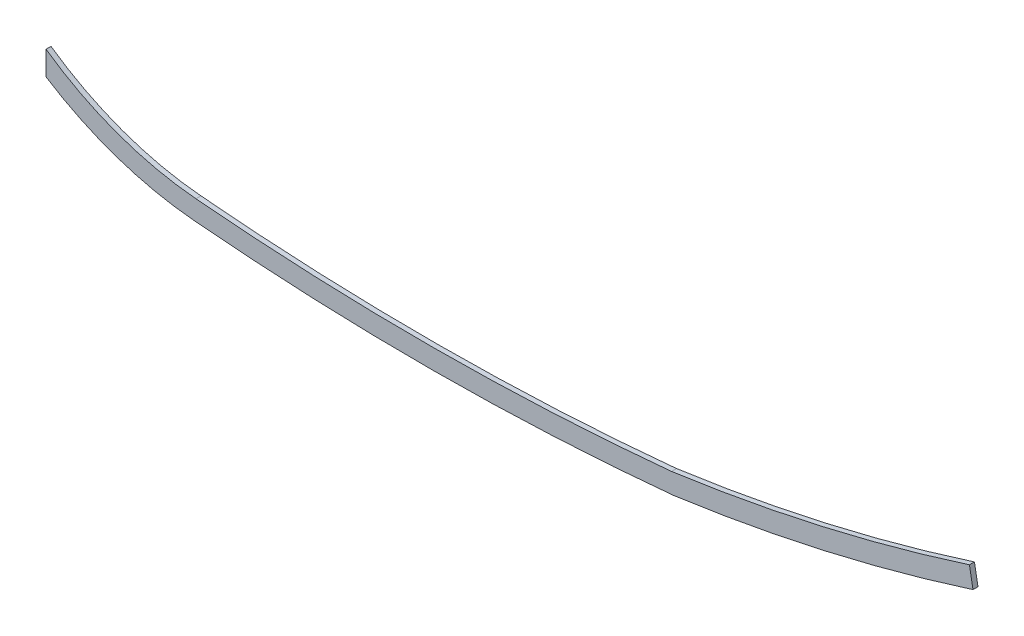
ISO-10303-21;
HEADER;
FILE_DESCRIPTION(('STEP AP214'),'2;1');
FILE_NAME('part.step','',(''),(''),'','','');
FILE_SCHEMA(('AUTOMOTIVE_DESIGN { 1 0 10303 214 1 1 1 1 }'));
ENDSEC;
DATA;
#1=APPLICATION_CONTEXT('core data for automotive mechanical design processes');
#2=APPLICATION_PROTOCOL_DEFINITION('international standard','automotive_design',2000,#1);
#3=PRODUCT_CONTEXT('',#1,'mechanical');
#4=PRODUCT('Part','Part','',(#3));
#5=PRODUCT_RELATED_PRODUCT_CATEGORY('part','',(#4));
#6=PRODUCT_DEFINITION_FORMATION('','',#4);
#7=PRODUCT_DEFINITION_CONTEXT('part definition',#1,'design');
#8=PRODUCT_DEFINITION('design','',#6,#7);
#9=PRODUCT_DEFINITION_SHAPE('','',#8);
#10=(LENGTH_UNIT() NAMED_UNIT(*) SI_UNIT(.MILLI.,.METRE.));
#11=(NAMED_UNIT(*) PLANE_ANGLE_UNIT() SI_UNIT($,.RADIAN.));
#12=(NAMED_UNIT(*) SI_UNIT($,.STERADIAN.) SOLID_ANGLE_UNIT());
#13=UNCERTAINTY_MEASURE_WITH_UNIT(LENGTH_MEASURE(1.E-05),#10,'distance_accuracy_value','');
#14=(GEOMETRIC_REPRESENTATION_CONTEXT(3) GLOBAL_UNCERTAINTY_ASSIGNED_CONTEXT((#13)) GLOBAL_UNIT_ASSIGNED_CONTEXT((#10,
#11,#12)) REPRESENTATION_CONTEXT('',''));
#15=CARTESIAN_POINT('',(0.,0.,0.));
#16=DIRECTION('',(0.,0.,1.));
#17=DIRECTION('',(1.,0.,0.));
#18=AXIS2_PLACEMENT_3D('',#15,#16,#17);
#19=CARTESIAN_POINT('',(112.635238010283,82.55,1.5875));
#20=DIRECTION('',(0.,0.,-1.));
#21=DIRECTION('',(-1.,0.,0.));
#22=AXIS2_PLACEMENT_3D('',#19,#20,#21);
#23=CYLINDRICAL_SURFACE('',#22,209.18873061815);
#24=CARTESIAN_POINT('',(112.635238010283,82.55,-1.5875));
#25=DIRECTION('',(0.,0.,1.));
#26=DIRECTION('',(1.,0.,0.));
#27=AXIS2_PLACEMENT_3D('',#24,#25,#26);
#28=CIRCLE('',#27,209.18873061815);
#29=CARTESIAN_POINT('',(0.,-93.726,-1.5875));
#30=VERTEX_POINT('',#29);
#31=CARTESIAN_POINT('',(93.9799999999992,-125.805242584421,-1.5875));
#32=VERTEX_POINT('',#31);
#33=EDGE_CURVE('E133',#30,#32,#28,.T.);
#34=ORIENTED_EDGE('',*,*,#33,.T.);
#35=DIRECTION('',(0.,0.,-1.));
#36=VECTOR('',#35,1.);
#37=CARTESIAN_POINT('',(93.9799999999992,-125.805242584421,1.5875));
#38=LINE('',#37,#36);
#39=CARTESIAN_POINT('',(93.9799999999992,-125.805242584421,1.5875));
#40=VERTEX_POINT('',#39);
#41=EDGE_CURVE('E11',#40,#32,#38,.T.);
#42=ORIENTED_EDGE('',*,*,#41,.F.);
#43=CARTESIAN_POINT('',(112.635238010283,82.55,1.5875));
#44=DIRECTION('',(0.,0.,1.));
#45=DIRECTION('',(1.,0.,0.));
#46=AXIS2_PLACEMENT_3D('',#43,#44,#45);
#47=CIRCLE('',#46,209.18873061815);
#48=CARTESIAN_POINT('',(0.,-93.726,1.5875));
#49=VERTEX_POINT('',#48);
#50=EDGE_CURVE('E147',#49,#40,#47,.T.);
#51=ORIENTED_EDGE('',*,*,#50,.F.);
#52=DIRECTION('',(0.,0.,-1.));
#53=VECTOR('',#52,1.);
#54=CARTESIAN_POINT('',(0.,-93.726,1.5875));
#55=LINE('',#54,#53);
#56=EDGE_CURVE('E129',#49,#30,#55,.T.);
#57=ORIENTED_EDGE('',*,*,#56,.T.);
#58=EDGE_LOOP('',(#34,#42,#51,#57));
#59=FACE_BOUND('',#58,.T.);
#60=ADVANCED_FACE('F37',(#59),#23,.T.);
#61=CARTESIAN_POINT('',(241.511586840625,1518.58991396533,1.5875));
#62=DIRECTION('',(0.,0.,-1.));
#63=DIRECTION('',(-1.,0.,0.));
#64=AXIS2_PLACEMENT_3D('',#61,#62,#63);
#65=CYLINDRICAL_SURFACE('',#64,1651.);
#66=CARTESIAN_POINT('',(241.511586840625,1518.58991396533,-1.5875));
#67=DIRECTION('',(0.,0.,1.));
#68=DIRECTION('',(1.,0.,0.));
#69=AXIS2_PLACEMENT_3D('',#66,#67,#68);
#70=CIRCLE('',#69,1651.);
#71=CARTESIAN_POINT('',(400.203586993257,-124.765753286147,-1.5875));
#72=VERTEX_POINT('',#71);
#73=EDGE_CURVE('E136',#32,#72,#70,.T.);
#74=ORIENTED_EDGE('',*,*,#73,.T.);
#75=DIRECTION('',(0.,0.,-1.));
#76=VECTOR('',#75,1.);
#77=CARTESIAN_POINT('',(400.203586993257,-124.765753286147,1.5875));
#78=LINE('',#77,#76);
#79=CARTESIAN_POINT('',(400.203586993257,-124.765753286147,1.5875));
#80=VERTEX_POINT('',#79);
#81=EDGE_CURVE('E45',#80,#72,#78,.T.);
#82=ORIENTED_EDGE('',*,*,#81,.F.);
#83=CARTESIAN_POINT('',(241.511586840625,1518.58991396533,1.5875));
#84=DIRECTION('',(0.,0.,1.));
#85=DIRECTION('',(1.,0.,0.));
#86=AXIS2_PLACEMENT_3D('',#83,#84,#85);
#87=CIRCLE('',#86,1651.);
#88=EDGE_CURVE('E96',#40,#80,#87,.T.);
#89=ORIENTED_EDGE('',*,*,#88,.F.);
#90=ORIENTED_EDGE('',*,*,#41,.T.);
#91=EDGE_LOOP('',(#74,#82,#89,#90));
#92=FACE_BOUND('',#91,.T.);
#93=ADVANCED_FACE('F182',(#92),#65,.T.);
#94=CARTESIAN_POINT('',(242.705707461571,1007.33115861805,1.5875));
#95=DIRECTION('',(0.,0.,-1.));
#96=DIRECTION('',(-1.,0.,0.));
#97=AXIS2_PLACEMENT_3D('',#94,#95,#96);
#98=CYLINDRICAL_SURFACE('',#97,1143.);
#99=CARTESIAN_POINT('',(242.705707461571,1007.33115861805,-1.5875));
#100=DIRECTION('',(0.,0.,1.));
#101=DIRECTION('',(1.,0.,0.));
#102=AXIS2_PLACEMENT_3D('',#99,#100,#101);
#103=CIRCLE('',#102,1143.);
#104=CARTESIAN_POINT('',(590.864339182333,-81.3536291687202,-1.5875));
#105=VERTEX_POINT('',#104);
#106=EDGE_CURVE('E138',#72,#105,#103,.T.);
#107=ORIENTED_EDGE('',*,*,#106,.T.);
#108=DIRECTION('',(0.,0.,-1.));
#109=VECTOR('',#108,1.);
#110=CARTESIAN_POINT('',(590.864339182333,-81.3536291687202,1.5875));
#111=LINE('',#110,#109);
#112=CARTESIAN_POINT('',(590.864339182333,-81.3536291687202,1.5875));
#113=VERTEX_POINT('',#112);
#114=EDGE_CURVE('E154',#113,#105,#111,.T.);
#115=ORIENTED_EDGE('',*,*,#114,.F.);
#116=CARTESIAN_POINT('',(242.705707461571,1007.33115861805,1.5875));
#117=DIRECTION('',(0.,0.,1.));
#118=DIRECTION('',(1.,0.,0.));
#119=AXIS2_PLACEMENT_3D('',#116,#117,#118);
#120=CIRCLE('',#119,1143.);
#121=EDGE_CURVE('E162',#80,#113,#120,.T.);
#122=ORIENTED_EDGE('',*,*,#121,.F.);
#123=ORIENTED_EDGE('',*,*,#81,.T.);
#124=EDGE_LOOP('',(#107,#115,#122,#123));
#125=FACE_BOUND('',#124,.T.);
#126=ADVANCED_FACE('F160',(#125),#98,.T.);
#127=CARTESIAN_POINT('',(590.864339182333,-81.3536291687202,1.5875));
#128=DIRECTION('',(-0.983881237780973,-0.178823124742246,0.));
#129=DIRECTION('',(0.178823124742246,-0.983881237780973,0.));
#130=AXIS2_PLACEMENT_3D('',#127,#128,#129);
#131=PLANE('',#130);
#132=DIRECTION('',(-0.178823124742246,0.983881237780973,0.));
#133=VECTOR('',#132,1.);
#134=CARTESIAN_POINT('',(590.864339182333,-81.3536291687202,-1.5875));
#135=LINE('',#134,#133);
#136=CARTESIAN_POINT('',(588.578984507179,-68.7796536842873,-1.5875));
#137=VERTEX_POINT('',#136);
#138=EDGE_CURVE('E140',#105,#137,#135,.T.);
#139=ORIENTED_EDGE('',*,*,#138,.T.);
#140=DIRECTION('',(0.,0.,-1.));
#141=VECTOR('',#140,1.);
#142=CARTESIAN_POINT('',(588.578984507179,-68.7796536842873,1.5875));
#143=LINE('',#142,#141);
#144=CARTESIAN_POINT('',(588.578984507179,-68.7796536842873,1.5875));
#145=VERTEX_POINT('',#144);
#146=EDGE_CURVE('E151',#145,#137,#143,.T.);
#147=ORIENTED_EDGE('',*,*,#146,.F.);
#148=DIRECTION('',(-0.178823124742246,0.983881237780973,0.));
#149=VECTOR('',#148,1.);
#150=CARTESIAN_POINT('',(590.864339182333,-81.3536291687202,1.5875));
#151=LINE('',#150,#149);
#152=EDGE_CURVE('E174',#113,#145,#151,.T.);
#153=ORIENTED_EDGE('',*,*,#152,.F.);
#154=ORIENTED_EDGE('',*,*,#114,.T.);
#155=EDGE_LOOP('',(#139,#147,#153,#154));
#156=FACE_BOUND('',#155,.T.);
#157=ADVANCED_FACE('F170',(#156),#131,.F.);
#158=CARTESIAN_POINT('',(242.705707461571,1007.33115861805,1.5875));
#159=DIRECTION('',(0.,0.,-1.));
#160=DIRECTION('',(-1.,0.,0.));
#161=AXIS2_PLACEMENT_3D('',#158,#159,#160);
#162=CYLINDRICAL_SURFACE('',#161,1130.32862660744);
#163=CARTESIAN_POINT('',(242.705707461571,1007.33115861805,-1.5875));
#164=DIRECTION('',(0.,0.,-1.));
#165=DIRECTION('',(1.,0.,0.));
#166=AXIS2_PLACEMENT_3D('',#163,#164,#165);
#167=CIRCLE('',#166,1130.32862660744);
#168=CARTESIAN_POINT('',(398.720709802555,-112.178610509851,-1.5875));
#169=VERTEX_POINT('',#168);
#170=EDGE_CURVE('E142',#137,#169,#167,.T.);
#171=ORIENTED_EDGE('',*,*,#170,.T.);
#172=DIRECTION('',(0.,0.,-1.));
#173=VECTOR('',#172,1.);
#174=CARTESIAN_POINT('',(398.720709802555,-112.178610509851,1.5875));
#175=LINE('',#174,#173);
#176=CARTESIAN_POINT('',(398.720709802555,-112.178610509851,1.5875));
#177=VERTEX_POINT('',#176);
#178=EDGE_CURVE('E124',#177,#169,#175,.T.);
#179=ORIENTED_EDGE('',*,*,#178,.F.);
#180=CARTESIAN_POINT('',(242.705707461571,1007.33115861805,1.5875));
#181=DIRECTION('',(0.,0.,-1.));
#182=DIRECTION('',(1.,0.,0.));
#183=AXIS2_PLACEMENT_3D('',#180,#181,#182);
#184=CIRCLE('',#183,1130.32862660744);
#185=EDGE_CURVE('E115',#145,#177,#184,.T.);
#186=ORIENTED_EDGE('',*,*,#185,.F.);
#187=ORIENTED_EDGE('',*,*,#146,.T.);
#188=EDGE_LOOP('',(#171,#179,#186,#187));
#189=FACE_BOUND('',#188,.T.);
#190=ADVANCED_FACE('F173',(#189),#162,.F.);
#191=CARTESIAN_POINT('',(241.511586840625,1518.58991396533,1.5875));
#192=DIRECTION('',(0.,0.,-1.));
#193=DIRECTION('',(-1.,0.,0.));
#194=AXIS2_PLACEMENT_3D('',#191,#192,#193);
#195=CYLINDRICAL_SURFACE('',#194,1638.32862660744);
#196=CARTESIAN_POINT('',(241.511586840625,1518.58991396533,-1.5875));
#197=DIRECTION('',(0.,0.,-1.));
#198=DIRECTION('',(1.,0.,0.));
#199=AXIS2_PLACEMENT_3D('',#196,#197,#198);
#200=CIRCLE('',#199,1638.32862660744);
#201=CARTESIAN_POINT('',(95.5675000000007,-113.225336691948,-1.5875));
#202=VERTEX_POINT('',#201);
#203=EDGE_CURVE('E123',#169,#202,#200,.T.);
#204=ORIENTED_EDGE('',*,*,#203,.T.);
#205=DIRECTION('',(0.,0.,-1.));
#206=VECTOR('',#205,1.);
#207=CARTESIAN_POINT('',(95.5675000000007,-113.225336691948,1.5875));
#208=LINE('',#207,#206);
#209=CARTESIAN_POINT('',(95.5675000000007,-113.225336691948,1.5875));
#210=VERTEX_POINT('',#209);
#211=EDGE_CURVE('E120',#210,#202,#208,.T.);
#212=ORIENTED_EDGE('',*,*,#211,.F.);
#213=CARTESIAN_POINT('',(241.511586840625,1518.58991396533,1.5875));
#214=DIRECTION('',(0.,0.,-1.));
#215=DIRECTION('',(1.,0.,0.));
#216=AXIS2_PLACEMENT_3D('',#213,#214,#215);
#217=CIRCLE('',#216,1638.32862660744);
#218=EDGE_CURVE('E109',#177,#210,#217,.T.);
#219=ORIENTED_EDGE('',*,*,#218,.F.);
#220=ORIENTED_EDGE('',*,*,#178,.T.);
#221=EDGE_LOOP('',(#204,#212,#219,#220));
#222=FACE_BOUND('',#221,.T.);
#223=ADVANCED_FACE('F121',(#222),#195,.F.);
#224=CARTESIAN_POINT('',(112.635238010283,82.55,1.5875));
#225=DIRECTION('',(0.,0.,-1.));
#226=DIRECTION('',(-1.,0.,0.));
#227=AXIS2_PLACEMENT_3D('',#224,#225,#226);
#228=CYLINDRICAL_SURFACE('',#227,196.517913019738);
#229=CARTESIAN_POINT('',(112.635238010283,82.55,-1.5875));
#230=DIRECTION('',(0.,0.,-1.));
#231=DIRECTION('',(1.,0.,0.));
#232=AXIS2_PLACEMENT_3D('',#229,#230,#231);
#233=CIRCLE('',#232,196.517913019738);
#234=CARTESIAN_POINT('',(0.,-78.486,-1.5875));
#235=VERTEX_POINT('',#234);
#236=EDGE_CURVE('E82',#202,#235,#233,.T.);
#237=ORIENTED_EDGE('',*,*,#236,.T.);
#238=DIRECTION('',(0.,0.,-1.));
#239=VECTOR('',#238,1.);
#240=CARTESIAN_POINT('',(0.,-78.486,1.5875));
#241=LINE('',#240,#239);
#242=CARTESIAN_POINT('',(0.,-78.486,1.5875));
#243=VERTEX_POINT('',#242);
#244=EDGE_CURVE('E125',#243,#235,#241,.T.);
#245=ORIENTED_EDGE('',*,*,#244,.F.);
#246=CARTESIAN_POINT('',(112.635238010283,82.55,1.5875));
#247=DIRECTION('',(0.,0.,-1.));
#248=DIRECTION('',(1.,0.,0.));
#249=AXIS2_PLACEMENT_3D('',#246,#247,#248);
#250=CIRCLE('',#249,196.517913019738);
#251=EDGE_CURVE('E113',#210,#243,#250,.T.);
#252=ORIENTED_EDGE('',*,*,#251,.F.);
#253=ORIENTED_EDGE('',*,*,#211,.T.);
#254=EDGE_LOOP('',(#237,#245,#252,#253));
#255=FACE_BOUND('',#254,.T.);
#256=ADVANCED_FACE('F127',(#255),#228,.F.);
#257=CARTESIAN_POINT('',(0.,-93.726,1.5875));
#258=DIRECTION('',(1.,0.,0.));
#259=DIRECTION('',(0.,0.,-1.));
#260=AXIS2_PLACEMENT_3D('',#257,#258,#259);
#261=PLANE('',#260);
#262=DIRECTION('',(0.,-1.,0.));
#263=VECTOR('',#262,1.);
#264=CARTESIAN_POINT('',(0.,-93.726,-1.5875));
#265=LINE('',#264,#263);
#266=EDGE_CURVE('E88',#235,#30,#265,.T.);
#267=ORIENTED_EDGE('',*,*,#266,.T.);
#268=ORIENTED_EDGE('',*,*,#56,.F.);
#269=DIRECTION('',(0.,-1.,0.));
#270=VECTOR('',#269,1.);
#271=CARTESIAN_POINT('',(0.,-93.726,1.5875));
#272=LINE('',#271,#270);
#273=EDGE_CURVE('E53',#243,#49,#272,.T.);
#274=ORIENTED_EDGE('',*,*,#273,.F.);
#275=ORIENTED_EDGE('',*,*,#244,.T.);
#276=EDGE_LOOP('',(#267,#268,#274,#275));
#277=FACE_BOUND('',#276,.T.);
#278=ADVANCED_FACE('F198',(#277),#261,.F.);
#279=CARTESIAN_POINT('',(112.635238010283,82.55,1.5875));
#280=DIRECTION('',(0.,0.,1.));
#281=DIRECTION('',(1.,0.,0.));
#282=AXIS2_PLACEMENT_3D('',#279,#280,#281);
#283=PLANE('',#282);
#284=ORIENTED_EDGE('',*,*,#50,.T.);
#285=ORIENTED_EDGE('',*,*,#88,.T.);
#286=ORIENTED_EDGE('',*,*,#121,.T.);
#287=ORIENTED_EDGE('',*,*,#152,.T.);
#288=ORIENTED_EDGE('',*,*,#185,.T.);
#289=ORIENTED_EDGE('',*,*,#218,.T.);
#290=ORIENTED_EDGE('',*,*,#251,.T.);
#291=ORIENTED_EDGE('',*,*,#273,.T.);
#292=EDGE_LOOP('',(#284,#285,#286,#287,#288,#289,#290,#291));
#293=FACE_BOUND('',#292,.T.);
#294=ADVANCED_FACE('F111',(#293),#283,.T.);
#295=CARTESIAN_POINT('',(112.635238010283,82.55,-1.5875));
#296=DIRECTION('',(0.,0.,1.));
#297=DIRECTION('',(1.,0.,0.));
#298=AXIS2_PLACEMENT_3D('',#295,#296,#297);
#299=PLANE('',#298);
#300=ORIENTED_EDGE('',*,*,#33,.F.);
#301=ORIENTED_EDGE('',*,*,#266,.F.);
#302=ORIENTED_EDGE('',*,*,#236,.F.);
#303=ORIENTED_EDGE('',*,*,#203,.F.);
#304=ORIENTED_EDGE('',*,*,#170,.F.);
#305=ORIENTED_EDGE('',*,*,#138,.F.);
#306=ORIENTED_EDGE('',*,*,#106,.F.);
#307=ORIENTED_EDGE('',*,*,#73,.F.);
#308=EDGE_LOOP('',(#300,#301,#302,#303,#304,#305,#306,#307));
#309=FACE_BOUND('',#308,.T.);
#310=ADVANCED_FACE('F166',(#309),#299,.F.);
#311=CLOSED_SHELL('',(#60,#93,#126,#157,#190,#223,#256,#278,#294,#310));
#312=MANIFOLD_SOLID_BREP('B2',#311);
#313=ADVANCED_BREP_SHAPE_REPRESENTATION('',(#18,#312),#14);
#314=SHAPE_DEFINITION_REPRESENTATION(#9,#313);
ENDSEC;
END-ISO-10303-21;
